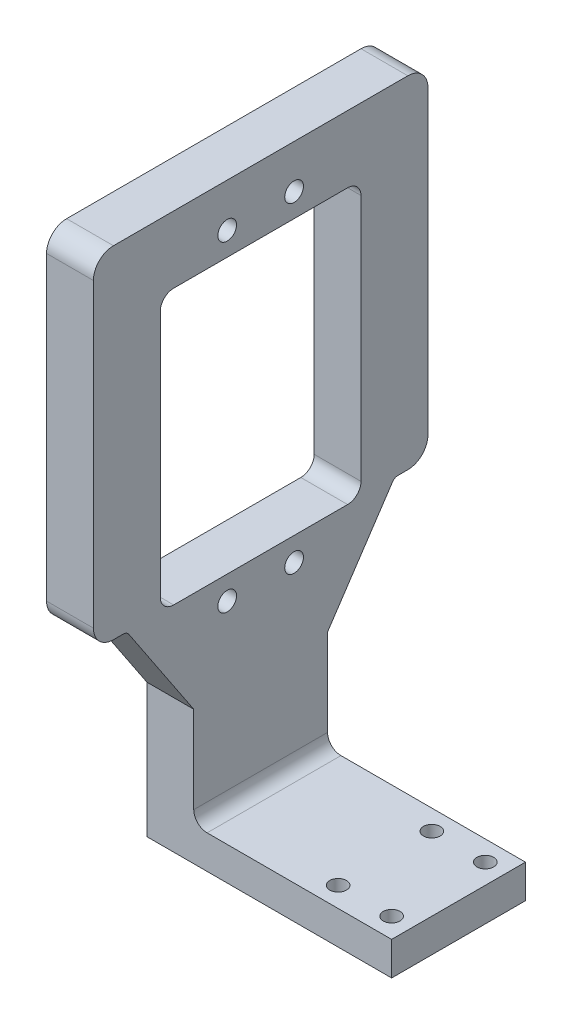
ISO-10303-21;
HEADER;
FILE_DESCRIPTION(('STEP AP214'),'2;1');
FILE_NAME('part.step','',(''),(''),'','','');
FILE_SCHEMA(('AUTOMOTIVE_DESIGN { 1 0 10303 214 1 1 1 1 }'));
ENDSEC;
DATA;
#1=APPLICATION_CONTEXT('core data for automotive mechanical design processes');
#2=APPLICATION_PROTOCOL_DEFINITION('international standard','automotive_design',2000,#1);
#3=PRODUCT_CONTEXT('',#1,'mechanical');
#4=PRODUCT('Part','Part','',(#3));
#5=PRODUCT_RELATED_PRODUCT_CATEGORY('part','',(#4));
#6=PRODUCT_DEFINITION_FORMATION('','',#4);
#7=PRODUCT_DEFINITION_CONTEXT('part definition',#1,'design');
#8=PRODUCT_DEFINITION('design','',#6,#7);
#9=PRODUCT_DEFINITION_SHAPE('','',#8);
#10=(LENGTH_UNIT() NAMED_UNIT(*) SI_UNIT(.MILLI.,.METRE.));
#11=(NAMED_UNIT(*) PLANE_ANGLE_UNIT() SI_UNIT($,.RADIAN.));
#12=(NAMED_UNIT(*) SI_UNIT($,.STERADIAN.) SOLID_ANGLE_UNIT());
#13=UNCERTAINTY_MEASURE_WITH_UNIT(LENGTH_MEASURE(1.E-05),#10,'distance_accuracy_value','');
#14=(GEOMETRIC_REPRESENTATION_CONTEXT(3) GLOBAL_UNCERTAINTY_ASSIGNED_CONTEXT((#13)) GLOBAL_UNIT_ASSIGNED_CONTEXT((#10,
#11,#12)) REPRESENTATION_CONTEXT('',''));
#15=CARTESIAN_POINT('',(0.,0.,0.));
#16=DIRECTION('',(0.,0.,1.));
#17=DIRECTION('',(1.,0.,0.));
#18=AXIS2_PLACEMENT_3D('',#15,#16,#17);
#19=CARTESIAN_POINT('',(0.,5.,0.));
#20=DIRECTION('',(0.,-1.,0.));
#21=DIRECTION('',(0.,0.,-1.));
#22=AXIS2_PLACEMENT_3D('',#19,#20,#21);
#23=PLANE('',#22);
#24=CARTESIAN_POINT('',(25.58,5.,-17.));
#25=DIRECTION('',(0.,1.,0.));
#26=DIRECTION('',(0.,0.,-1.));
#27=AXIS2_PLACEMENT_3D('',#24,#25,#26);
#28=CIRCLE('',#27,1.25);
#29=CARTESIAN_POINT('',(25.58,5.,-18.25));
#30=VERTEX_POINT('',#29);
#31=EDGE_CURVE('E299',#30,#30,#28,.T.);
#32=ORIENTED_EDGE('',*,*,#31,.F.);
#33=EDGE_LOOP('',(#32));
#34=FACE_BOUND('',#33,.T.);
#35=CARTESIAN_POINT('',(33.58,5.,-17.));
#36=DIRECTION('',(0.,1.,0.));
#37=DIRECTION('',(0.,0.,-1.));
#38=AXIS2_PLACEMENT_3D('',#35,#36,#37);
#39=CIRCLE('',#38,1.25);
#40=CARTESIAN_POINT('',(33.58,5.,-18.25));
#41=VERTEX_POINT('',#40);
#42=EDGE_CURVE('E305',#41,#41,#39,.T.);
#43=ORIENTED_EDGE('',*,*,#42,.F.);
#44=EDGE_LOOP('',(#43));
#45=FACE_BOUND('',#44,.T.);
#46=CARTESIAN_POINT('',(33.58,5.,-3.));
#47=DIRECTION('',(0.,1.,0.));
#48=DIRECTION('',(0.,0.,1.));
#49=AXIS2_PLACEMENT_3D('',#46,#47,#48);
#50=CIRCLE('',#49,1.25);
#51=CARTESIAN_POINT('',(33.58,5.,-1.75000000000001));
#52=VERTEX_POINT('',#51);
#53=EDGE_CURVE('E311',#52,#52,#50,.T.);
#54=ORIENTED_EDGE('',*,*,#53,.F.);
#55=EDGE_LOOP('',(#54));
#56=FACE_BOUND('',#55,.T.);
#57=CARTESIAN_POINT('',(25.58,5.,-3.));
#58=DIRECTION('',(0.,1.,0.));
#59=DIRECTION('',(0.,0.,1.));
#60=AXIS2_PLACEMENT_3D('',#57,#58,#59);
#61=CIRCLE('',#60,1.25);
#62=CARTESIAN_POINT('',(25.58,5.,-1.75));
#63=VERTEX_POINT('',#62);
#64=EDGE_CURVE('E317',#63,#63,#61,.T.);
#65=ORIENTED_EDGE('',*,*,#64,.F.);
#66=EDGE_LOOP('',(#65));
#67=FACE_BOUND('',#66,.T.);
#68=DIRECTION('',(-1.,0.,0.));
#69=VECTOR('',#68,1.);
#70=CARTESIAN_POINT('',(0.,5.,-20.));
#71=LINE('',#70,#69);
#72=CARTESIAN_POINT('',(36.58,5.,-20.));
#73=VERTEX_POINT('',#72);
#74=CARTESIAN_POINT('',(9.,5.,-20.));
#75=VERTEX_POINT('',#74);
#76=EDGE_CURVE('E328',#73,#75,#71,.T.);
#77=ORIENTED_EDGE('',*,*,#76,.T.);
#78=DIRECTION('',(0.,0.,-1.));
#79=VECTOR('',#78,1.);
#80=CARTESIAN_POINT('',(9.,5.,0.));
#81=LINE('',#80,#79);
#82=CARTESIAN_POINT('',(9.,5.,0.));
#83=VERTEX_POINT('',#82);
#84=EDGE_CURVE('E405',#75,#83,#81,.F.);
#85=ORIENTED_EDGE('',*,*,#84,.T.);
#86=DIRECTION('',(1.,0.,0.));
#87=VECTOR('',#86,1.);
#88=CARTESIAN_POINT('',(0.,5.,0.));
#89=LINE('',#88,#87);
#90=CARTESIAN_POINT('',(36.58,5.,0.));
#91=VERTEX_POINT('',#90);
#92=EDGE_CURVE('E323',#83,#91,#89,.T.);
#93=ORIENTED_EDGE('',*,*,#92,.T.);
#94=DIRECTION('',(0.,0.,-1.));
#95=VECTOR('',#94,1.);
#96=CARTESIAN_POINT('',(36.58,5.,0.));
#97=LINE('',#96,#95);
#98=EDGE_CURVE('E325',#91,#73,#97,.T.);
#99=ORIENTED_EDGE('',*,*,#98,.T.);
#100=EDGE_LOOP('',(#77,#85,#93,#99));
#101=FACE_BOUND('',#100,.T.);
#102=ADVANCED_FACE('F35',(#34,#45,#56,#67,#101),#23,.F.);
#103=CARTESIAN_POINT('',(0.,0.,0.));
#104=DIRECTION('',(0.,-1.,0.));
#105=DIRECTION('',(0.,0.,-1.));
#106=AXIS2_PLACEMENT_3D('',#103,#104,#105);
#107=PLANE('',#106);
#108=CARTESIAN_POINT('',(33.58,0.,-17.));
#109=DIRECTION('',(0.,1.,0.));
#110=DIRECTION('',(0.,0.,-1.));
#111=AXIS2_PLACEMENT_3D('',#108,#109,#110);
#112=CIRCLE('',#111,1.25);
#113=CARTESIAN_POINT('',(33.58,0.,-18.25));
#114=VERTEX_POINT('',#113);
#115=EDGE_CURVE('E302',#114,#114,#112,.T.);
#116=ORIENTED_EDGE('',*,*,#115,.T.);
#117=EDGE_LOOP('',(#116));
#118=FACE_BOUND('',#117,.T.);
#119=CARTESIAN_POINT('',(25.58,0.,-3.));
#120=DIRECTION('',(0.,1.,0.));
#121=DIRECTION('',(0.,0.,1.));
#122=AXIS2_PLACEMENT_3D('',#119,#120,#121);
#123=CIRCLE('',#122,1.25);
#124=CARTESIAN_POINT('',(25.58,0.,-1.75));
#125=VERTEX_POINT('',#124);
#126=EDGE_CURVE('E314',#125,#125,#123,.T.);
#127=ORIENTED_EDGE('',*,*,#126,.T.);
#128=EDGE_LOOP('',(#127));
#129=FACE_BOUND('',#128,.T.);
#130=DIRECTION('',(0.,0.,1.));
#131=VECTOR('',#130,1.);
#132=CARTESIAN_POINT('',(0.,0.,0.));
#133=LINE('',#132,#131);
#134=CARTESIAN_POINT('',(0.,0.,-20.));
#135=VERTEX_POINT('',#134);
#136=CARTESIAN_POINT('',(0.,0.,0.));
#137=VERTEX_POINT('',#136);
#138=EDGE_CURVE('E320',#135,#137,#133,.T.);
#139=ORIENTED_EDGE('',*,*,#138,.F.);
#140=DIRECTION('',(-1.,0.,0.));
#141=VECTOR('',#140,1.);
#142=CARTESIAN_POINT('',(0.,0.,-20.));
#143=LINE('',#142,#141);
#144=CARTESIAN_POINT('',(36.58,0.,-20.));
#145=VERTEX_POINT('',#144);
#146=EDGE_CURVE('E326',#145,#135,#143,.T.);
#147=ORIENTED_EDGE('',*,*,#146,.F.);
#148=DIRECTION('',(0.,0.,-1.));
#149=VECTOR('',#148,1.);
#150=CARTESIAN_POINT('',(36.58,0.,0.));
#151=LINE('',#150,#149);
#152=CARTESIAN_POINT('',(36.58,0.,0.));
#153=VERTEX_POINT('',#152);
#154=EDGE_CURVE('E335',#153,#145,#151,.T.);
#155=ORIENTED_EDGE('',*,*,#154,.F.);
#156=DIRECTION('',(1.,0.,0.));
#157=VECTOR('',#156,1.);
#158=CARTESIAN_POINT('',(0.,0.,0.));
#159=LINE('',#158,#157);
#160=EDGE_CURVE('E333',#137,#153,#159,.T.);
#161=ORIENTED_EDGE('',*,*,#160,.F.);
#162=EDGE_LOOP('',(#139,#147,#155,#161));
#163=FACE_BOUND('',#162,.T.);
#164=CARTESIAN_POINT('',(33.58,0.,-3.));
#165=DIRECTION('',(0.,1.,0.));
#166=DIRECTION('',(0.,0.,1.));
#167=AXIS2_PLACEMENT_3D('',#164,#165,#166);
#168=CIRCLE('',#167,1.25);
#169=CARTESIAN_POINT('',(33.58,0.,-1.75000000000001));
#170=VERTEX_POINT('',#169);
#171=EDGE_CURVE('E308',#170,#170,#168,.T.);
#172=ORIENTED_EDGE('',*,*,#171,.T.);
#173=EDGE_LOOP('',(#172));
#174=FACE_BOUND('',#173,.T.);
#175=CARTESIAN_POINT('',(25.58,0.,-17.));
#176=DIRECTION('',(0.,1.,0.));
#177=DIRECTION('',(0.,0.,-1.));
#178=AXIS2_PLACEMENT_3D('',#175,#176,#177);
#179=CIRCLE('',#178,1.25);
#180=CARTESIAN_POINT('',(25.58,0.,-18.25));
#181=VERTEX_POINT('',#180);
#182=EDGE_CURVE('E297',#181,#181,#179,.T.);
#183=ORIENTED_EDGE('',*,*,#182,.T.);
#184=EDGE_LOOP('',(#183));
#185=FACE_BOUND('',#184,.T.);
#186=ADVANCED_FACE('F483',(#118,#129,#163,#174,#185),#107,.T.);
#187=CARTESIAN_POINT('',(0.,5.,0.));
#188=DIRECTION('',(1.,0.,0.));
#189=DIRECTION('',(0.,0.,-1.));
#190=AXIS2_PLACEMENT_3D('',#187,#188,#189);
#191=PLANE('',#190);
#192=CARTESIAN_POINT('',(0.,31.5,-5.));
#193=DIRECTION('',(-1.,0.,0.));
#194=DIRECTION('',(0.,0.,-1.));
#195=AXIS2_PLACEMENT_3D('',#192,#193,#194);
#196=CIRCLE('',#195,1.4);
#197=CARTESIAN_POINT('',(0.,31.5,-6.4));
#198=VERTEX_POINT('',#197);
#199=EDGE_CURVE('E570',#198,#198,#196,.T.);
#200=ORIENTED_EDGE('',*,*,#199,.F.);
#201=EDGE_LOOP('',(#200));
#202=FACE_BOUND('',#201,.T.);
#203=CARTESIAN_POINT('',(0.,79.5,-15.));
#204=DIRECTION('',(-1.,0.,0.));
#205=DIRECTION('',(0.,0.,-1.));
#206=AXIS2_PLACEMENT_3D('',#203,#204,#205);
#207=CIRCLE('',#206,1.4);
#208=CARTESIAN_POINT('',(0.,79.5,-16.4));
#209=VERTEX_POINT('',#208);
#210=EDGE_CURVE('E571',#209,#209,#207,.T.);
#211=ORIENTED_EDGE('',*,*,#210,.F.);
#212=EDGE_LOOP('',(#211));
#213=FACE_BOUND('',#212,.T.);
#214=CARTESIAN_POINT('',(0.,79.5,-5.));
#215=DIRECTION('',(-1.,0.,0.));
#216=DIRECTION('',(0.,0.,1.));
#217=AXIS2_PLACEMENT_3D('',#214,#215,#216);
#218=CIRCLE('',#217,1.4);
#219=CARTESIAN_POINT('',(0.,79.5,-3.6));
#220=VERTEX_POINT('',#219);
#221=EDGE_CURVE('E581',#220,#220,#218,.T.);
#222=ORIENTED_EDGE('',*,*,#221,.F.);
#223=EDGE_LOOP('',(#222));
#224=FACE_BOUND('',#223,.T.);
#225=CARTESIAN_POINT('',(0.,31.5,-15.));
#226=DIRECTION('',(-1.,0.,0.));
#227=DIRECTION('',(0.,0.,1.));
#228=AXIS2_PLACEMENT_3D('',#225,#226,#227);
#229=CIRCLE('',#228,1.4);
#230=CARTESIAN_POINT('',(0.,31.5,-13.6));
#231=VERTEX_POINT('',#230);
#232=EDGE_CURVE('E563',#231,#231,#229,.T.);
#233=ORIENTED_EDGE('',*,*,#232,.F.);
#234=EDGE_LOOP('',(#233));
#235=FACE_BOUND('',#234,.T.);
#236=DIRECTION('',(0.,0.,1.));
#237=VECTOR('',#236,1.);
#238=CARTESIAN_POINT('',(0.,86.,0.));
#239=LINE('',#238,#237);
#240=CARTESIAN_POINT('',(0.,86.,-32.));
#241=VERTEX_POINT('',#240);
#242=CARTESIAN_POINT('',(0.,86.,12.));
#243=VERTEX_POINT('',#242);
#244=EDGE_CURVE('E268',#241,#243,#239,.T.);
#245=ORIENTED_EDGE('',*,*,#244,.F.);
#246=CARTESIAN_POINT('',(0.,83.,-32.));
#247=DIRECTION('',(1.,0.,0.));
#248=DIRECTION('',(0.,0.,-1.));
#249=AXIS2_PLACEMENT_3D('',#246,#247,#248);
#250=CIRCLE('',#249,3.);
#251=CARTESIAN_POINT('',(0.,83.,-35.));
#252=VERTEX_POINT('',#251);
#253=EDGE_CURVE('E360',#241,#252,#250,.F.);
#254=ORIENTED_EDGE('',*,*,#253,.T.);
#255=DIRECTION('',(0.,1.,0.));
#256=VECTOR('',#255,1.);
#257=CARTESIAN_POINT('',(0.,0.,-35.));
#258=LINE('',#257,#256);
#259=CARTESIAN_POINT('',(0.,38.,-35.));
#260=VERTEX_POINT('',#259);
#261=EDGE_CURVE('E272',#260,#252,#258,.T.);
#262=ORIENTED_EDGE('',*,*,#261,.F.);
#263=CARTESIAN_POINT('',(0.,38.,-32.));
#264=DIRECTION('',(1.,0.,0.));
#265=DIRECTION('',(0.,0.,-1.));
#266=AXIS2_PLACEMENT_3D('',#263,#264,#265);
#267=CIRCLE('',#266,3.);
#268=CARTESIAN_POINT('',(0.,35.,-32.));
#269=VERTEX_POINT('',#268);
#270=EDGE_CURVE('E353',#260,#269,#267,.F.);
#271=ORIENTED_EDGE('',*,*,#270,.T.);
#272=DIRECTION('',(0.,0.,-1.));
#273=VECTOR('',#272,1.);
#274=CARTESIAN_POINT('',(0.,35.,0.));
#275=LINE('',#274,#273);
#276=CARTESIAN_POINT('',(0.,35.,-30.535183758488));
#277=VERTEX_POINT('',#276);
#278=EDGE_CURVE('E275',#277,#269,#275,.T.);
#279=ORIENTED_EDGE('',*,*,#278,.F.);
#280=CARTESIAN_POINT('',(0.,34.,-30.535183758488));
#281=DIRECTION('',(1.,0.,0.));
#282=DIRECTION('',(0.,0.,-1.));
#283=AXIS2_PLACEMENT_3D('',#280,#281,#282);
#284=CIRCLE('',#283,1.);
#285=CARTESIAN_POINT('',(0.,34.5547001962252,-29.7031334641502));
#286=VERTEX_POINT('',#285);
#287=EDGE_CURVE('E400',#277,#286,#284,.T.);
#288=ORIENTED_EDGE('',*,*,#287,.T.);
#289=DIRECTION('',(0.,0.832050294337844,-0.554700196225229));
#290=VECTOR('',#289,1.);
#291=CARTESIAN_POINT('',(0.,-3.07692307692308,-4.61538461538461));
#292=LINE('',#291,#290);
#293=CARTESIAN_POINT('',(0.,20.,-20.));
#294=VERTEX_POINT('',#293);
#295=EDGE_CURVE('E277',#294,#286,#292,.T.);
#296=ORIENTED_EDGE('',*,*,#295,.F.);
#297=DIRECTION('',(0.,-1.,0.));
#298=VECTOR('',#297,1.);
#299=CARTESIAN_POINT('',(0.,5.,-20.));
#300=LINE('',#299,#298);
#301=EDGE_CURVE('E232',#294,#135,#300,.T.);
#302=ORIENTED_EDGE('',*,*,#301,.T.);
#303=ORIENTED_EDGE('',*,*,#138,.T.);
#304=DIRECTION('',(0.,-1.,0.));
#305=VECTOR('',#304,1.);
#306=CARTESIAN_POINT('',(0.,5.,0.));
#307=LINE('',#306,#305);
#308=CARTESIAN_POINT('',(0.,20.,0.));
#309=VERTEX_POINT('',#308);
#310=EDGE_CURVE('E345',#309,#137,#307,.T.);
#311=ORIENTED_EDGE('',*,*,#310,.F.);
#312=DIRECTION('',(0.,0.832050294337844,0.554700196225229));
#313=VECTOR('',#312,1.);
#314=CARTESIAN_POINT('',(0.,6.15384615384615,-9.23076923076923));
#315=LINE('',#314,#313);
#316=CARTESIAN_POINT('',(0.,34.5547001962252,9.70313346415015));
#317=VERTEX_POINT('',#316);
#318=EDGE_CURVE('E279',#309,#317,#315,.T.);
#319=ORIENTED_EDGE('',*,*,#318,.T.);
#320=CARTESIAN_POINT('',(0.,34.,10.535183758488));
#321=DIRECTION('',(1.,0.,0.));
#322=DIRECTION('',(0.,0.,-1.));
#323=AXIS2_PLACEMENT_3D('',#320,#321,#322);
#324=CIRCLE('',#323,1.);
#325=CARTESIAN_POINT('',(0.,35.,10.535183758488));
#326=VERTEX_POINT('',#325);
#327=EDGE_CURVE('E396',#317,#326,#324,.T.);
#328=ORIENTED_EDGE('',*,*,#327,.T.);
#329=DIRECTION('',(0.,0.,1.));
#330=VECTOR('',#329,1.);
#331=CARTESIAN_POINT('',(0.,35.,0.));
#332=LINE('',#331,#330);
#333=CARTESIAN_POINT('',(0.,35.,12.));
#334=VERTEX_POINT('',#333);
#335=EDGE_CURVE('E282',#326,#334,#332,.T.);
#336=ORIENTED_EDGE('',*,*,#335,.T.);
#337=CARTESIAN_POINT('',(0.,38.,12.));
#338=DIRECTION('',(1.,0.,0.));
#339=DIRECTION('',(0.,0.,-1.));
#340=AXIS2_PLACEMENT_3D('',#337,#338,#339);
#341=CIRCLE('',#340,3.);
#342=CARTESIAN_POINT('',(0.,38.,15.));
#343=VERTEX_POINT('',#342);
#344=EDGE_CURVE('E356',#334,#343,#341,.F.);
#345=ORIENTED_EDGE('',*,*,#344,.T.);
#346=DIRECTION('',(0.,1.,0.));
#347=VECTOR('',#346,1.);
#348=CARTESIAN_POINT('',(0.,0.,15.));
#349=LINE('',#348,#347);
#350=CARTESIAN_POINT('',(0.,83.,15.));
#351=VERTEX_POINT('',#350);
#352=EDGE_CURVE('E265',#343,#351,#349,.T.);
#353=ORIENTED_EDGE('',*,*,#352,.T.);
#354=CARTESIAN_POINT('',(0.,83.,12.));
#355=DIRECTION('',(1.,0.,0.));
#356=DIRECTION('',(0.,0.,-1.));
#357=AXIS2_PLACEMENT_3D('',#354,#355,#356);
#358=CIRCLE('',#357,3.);
#359=EDGE_CURVE('E358',#351,#243,#358,.F.);
#360=ORIENTED_EDGE('',*,*,#359,.T.);
#361=EDGE_LOOP('',(#245,#254,#262,#271,#279,#288,#296,#302,#303,#311,#319,#328,#336,#345,#353,#360));
#362=FACE_BOUND('',#361,.T.);
#363=DIRECTION('',(0.,0.,-1.));
#364=VECTOR('',#363,1.);
#365=CARTESIAN_POINT('',(0.,76.,0.));
#366=LINE('',#365,#364);
#367=CARTESIAN_POINT('',(0.,76.,3.));
#368=VERTEX_POINT('',#367);
#369=CARTESIAN_POINT('',(0.,76.,-23.));
#370=VERTEX_POINT('',#369);
#371=EDGE_CURVE('E284',#368,#370,#366,.T.);
#372=ORIENTED_EDGE('',*,*,#371,.F.);
#373=CARTESIAN_POINT('',(0.,74.,3.));
#374=DIRECTION('',(1.,0.,0.));
#375=DIRECTION('',(0.,0.,-1.));
#376=AXIS2_PLACEMENT_3D('',#373,#374,#375);
#377=CIRCLE('',#376,2.);
#378=CARTESIAN_POINT('',(0.,74.,5.));
#379=VERTEX_POINT('',#378);
#380=EDGE_CURVE('E50',#368,#379,#377,.T.);
#381=ORIENTED_EDGE('',*,*,#380,.T.);
#382=DIRECTION('',(0.,1.,0.));
#383=VECTOR('',#382,1.);
#384=CARTESIAN_POINT('',(0.,0.,5.));
#385=LINE('',#384,#383);
#386=CARTESIAN_POINT('',(0.,37.,5.));
#387=VERTEX_POINT('',#386);
#388=EDGE_CURVE('E287',#387,#379,#385,.T.);
#389=ORIENTED_EDGE('',*,*,#388,.F.);
#390=CARTESIAN_POINT('',(0.,37.,3.));
#391=DIRECTION('',(1.,0.,0.));
#392=DIRECTION('',(0.,0.,-1.));
#393=AXIS2_PLACEMENT_3D('',#390,#391,#392);
#394=CIRCLE('',#393,2.);
#395=CARTESIAN_POINT('',(0.,35.,3.));
#396=VERTEX_POINT('',#395);
#397=EDGE_CURVE('E43',#387,#396,#394,.T.);
#398=ORIENTED_EDGE('',*,*,#397,.T.);
#399=DIRECTION('',(0.,0.,1.));
#400=VECTOR('',#399,1.);
#401=CARTESIAN_POINT('',(0.,35.,0.));
#402=LINE('',#401,#400);
#403=CARTESIAN_POINT('',(0.,35.,-23.));
#404=VERTEX_POINT('',#403);
#405=EDGE_CURVE('E289',#404,#396,#402,.T.);
#406=ORIENTED_EDGE('',*,*,#405,.F.);
#407=CARTESIAN_POINT('',(0.,37.,-23.));
#408=DIRECTION('',(1.,0.,0.));
#409=DIRECTION('',(0.,0.,-1.));
#410=AXIS2_PLACEMENT_3D('',#407,#408,#409);
#411=CIRCLE('',#410,2.);
#412=CARTESIAN_POINT('',(0.,37.,-25.));
#413=VERTEX_POINT('',#412);
#414=EDGE_CURVE('E430',#404,#413,#411,.T.);
#415=ORIENTED_EDGE('',*,*,#414,.T.);
#416=DIRECTION('',(0.,1.,0.));
#417=VECTOR('',#416,1.);
#418=CARTESIAN_POINT('',(0.,0.,-25.));
#419=LINE('',#418,#417);
#420=CARTESIAN_POINT('',(0.,74.,-25.));
#421=VERTEX_POINT('',#420);
#422=EDGE_CURVE('E292',#413,#421,#419,.T.);
#423=ORIENTED_EDGE('',*,*,#422,.T.);
#424=CARTESIAN_POINT('',(0.,74.,-23.));
#425=DIRECTION('',(1.,0.,0.));
#426=DIRECTION('',(0.,0.,-1.));
#427=AXIS2_PLACEMENT_3D('',#424,#425,#426);
#428=CIRCLE('',#427,2.);
#429=EDGE_CURVE('E434',#421,#370,#428,.T.);
#430=ORIENTED_EDGE('',*,*,#429,.T.);
#431=EDGE_LOOP('',(#372,#381,#389,#398,#406,#415,#423,#430));
#432=FACE_BOUND('',#431,.T.);
#433=ADVANCED_FACE('F441',(#202,#213,#224,#235,#362,#432),#191,.F.);
#434=CARTESIAN_POINT('',(0.,5.,0.));
#435=DIRECTION('',(0.,0.,-1.));
#436=DIRECTION('',(-1.,0.,0.));
#437=AXIS2_PLACEMENT_3D('',#434,#435,#436);
#438=PLANE('',#437);
#439=ORIENTED_EDGE('',*,*,#160,.T.);
#440=DIRECTION('',(0.,-1.,0.));
#441=VECTOR('',#440,1.);
#442=CARTESIAN_POINT('',(36.58,5.,0.));
#443=LINE('',#442,#441);
#444=EDGE_CURVE('E342',#91,#153,#443,.T.);
#445=ORIENTED_EDGE('',*,*,#444,.F.);
#446=ORIENTED_EDGE('',*,*,#92,.F.);
#447=CARTESIAN_POINT('',(9.,7.,0.));
#448=DIRECTION('',(0.,0.,-1.));
#449=DIRECTION('',(-1.,0.,0.));
#450=AXIS2_PLACEMENT_3D('',#447,#448,#449);
#451=CIRCLE('',#450,2.);
#452=CARTESIAN_POINT('',(7.,7.,0.));
#453=VERTEX_POINT('',#452);
#454=EDGE_CURVE('E428',#83,#453,#451,.T.);
#455=ORIENTED_EDGE('',*,*,#454,.T.);
#456=DIRECTION('',(0.,1.,0.));
#457=VECTOR('',#456,1.);
#458=CARTESIAN_POINT('',(7.,0.,0.));
#459=LINE('',#458,#457);
#460=CARTESIAN_POINT('',(7.,20.,0.));
#461=VERTEX_POINT('',#460);
#462=EDGE_CURVE('E226',#453,#461,#459,.T.);
#463=ORIENTED_EDGE('',*,*,#462,.T.);
#464=DIRECTION('',(-1.,0.,0.));
#465=VECTOR('',#464,1.);
#466=CARTESIAN_POINT('',(7.,20.,0.));
#467=LINE('',#466,#465);
#468=EDGE_CURVE('E236',#461,#309,#467,.T.);
#469=ORIENTED_EDGE('',*,*,#468,.T.);
#470=ORIENTED_EDGE('',*,*,#310,.T.);
#471=EDGE_LOOP('',(#439,#445,#446,#455,#463,#469,#470));
#472=FACE_BOUND('',#471,.T.);
#473=ADVANCED_FACE('F502',(#472),#438,.F.);
#474=CARTESIAN_POINT('',(36.58,5.,0.));
#475=DIRECTION('',(-1.,0.,0.));
#476=DIRECTION('',(0.,0.,1.));
#477=AXIS2_PLACEMENT_3D('',#474,#475,#476);
#478=PLANE('',#477);
#479=ORIENTED_EDGE('',*,*,#154,.T.);
#480=DIRECTION('',(0.,-1.,0.));
#481=VECTOR('',#480,1.);
#482=CARTESIAN_POINT('',(36.58,5.,-20.));
#483=LINE('',#482,#481);
#484=EDGE_CURVE('E339',#73,#145,#483,.T.);
#485=ORIENTED_EDGE('',*,*,#484,.F.);
#486=ORIENTED_EDGE('',*,*,#98,.F.);
#487=ORIENTED_EDGE('',*,*,#444,.T.);
#488=EDGE_LOOP('',(#479,#485,#486,#487));
#489=FACE_BOUND('',#488,.T.);
#490=ADVANCED_FACE('F499',(#489),#478,.F.);
#491=CARTESIAN_POINT('',(0.,5.,-20.));
#492=DIRECTION('',(0.,0.,1.));
#493=DIRECTION('',(1.,0.,0.));
#494=AXIS2_PLACEMENT_3D('',#491,#492,#493);
#495=PLANE('',#494);
#496=ORIENTED_EDGE('',*,*,#146,.T.);
#497=ORIENTED_EDGE('',*,*,#301,.F.);
#498=DIRECTION('',(-1.,0.,0.));
#499=VECTOR('',#498,1.);
#500=CARTESIAN_POINT('',(7.,20.,-20.));
#501=LINE('',#500,#499);
#502=CARTESIAN_POINT('',(7.,20.,-20.));
#503=VERTEX_POINT('',#502);
#504=EDGE_CURVE('E229',#503,#294,#501,.T.);
#505=ORIENTED_EDGE('',*,*,#504,.F.);
#506=DIRECTION('',(0.,1.,0.));
#507=VECTOR('',#506,1.);
#508=CARTESIAN_POINT('',(7.,0.,-20.));
#509=LINE('',#508,#507);
#510=CARTESIAN_POINT('',(7.,7.,-20.));
#511=VERTEX_POINT('',#510);
#512=EDGE_CURVE('E215',#511,#503,#509,.T.);
#513=ORIENTED_EDGE('',*,*,#512,.F.);
#514=CARTESIAN_POINT('',(9.,7.,-20.));
#515=DIRECTION('',(0.,0.,1.));
#516=DIRECTION('',(1.,0.,0.));
#517=AXIS2_PLACEMENT_3D('',#514,#515,#516);
#518=CIRCLE('',#517,2.);
#519=EDGE_CURVE('E426',#511,#75,#518,.T.);
#520=ORIENTED_EDGE('',*,*,#519,.T.);
#521=ORIENTED_EDGE('',*,*,#76,.F.);
#522=ORIENTED_EDGE('',*,*,#484,.T.);
#523=EDGE_LOOP('',(#496,#497,#505,#513,#520,#521,#522));
#524=FACE_BOUND('',#523,.T.);
#525=ADVANCED_FACE('F230',(#524),#495,.F.);
#526=CARTESIAN_POINT('',(25.58,5.,-3.));
#527=DIRECTION('',(0.,-1.,0.));
#528=DIRECTION('',(0.,0.,-1.));
#529=AXIS2_PLACEMENT_3D('',#526,#527,#528);
#530=CYLINDRICAL_SURFACE('',#529,1.25);
#531=ORIENTED_EDGE('',*,*,#64,.T.);
#532=EDGE_LOOP('',(#531));
#533=FACE_BOUND('',#532,.T.);
#534=ORIENTED_EDGE('',*,*,#126,.F.);
#535=EDGE_LOOP('',(#534));
#536=FACE_BOUND('',#535,.T.);
#537=ADVANCED_FACE('F494',(#533,#536),#530,.F.);
#538=CARTESIAN_POINT('',(33.58,5.,-3.));
#539=DIRECTION('',(0.,-1.,0.));
#540=DIRECTION('',(0.,0.,-1.));
#541=AXIS2_PLACEMENT_3D('',#538,#539,#540);
#542=CYLINDRICAL_SURFACE('',#541,1.25);
#543=ORIENTED_EDGE('',*,*,#53,.T.);
#544=EDGE_LOOP('',(#543));
#545=FACE_BOUND('',#544,.T.);
#546=ORIENTED_EDGE('',*,*,#171,.F.);
#547=EDGE_LOOP('',(#546));
#548=FACE_BOUND('',#547,.T.);
#549=ADVANCED_FACE('F644',(#545,#548),#542,.F.);
#550=CARTESIAN_POINT('',(33.58,5.,-17.));
#551=DIRECTION('',(0.,-1.,0.));
#552=DIRECTION('',(0.,0.,-1.));
#553=AXIS2_PLACEMENT_3D('',#550,#551,#552);
#554=CYLINDRICAL_SURFACE('',#553,1.25);
#555=ORIENTED_EDGE('',*,*,#42,.T.);
#556=EDGE_LOOP('',(#555));
#557=FACE_BOUND('',#556,.T.);
#558=ORIENTED_EDGE('',*,*,#115,.F.);
#559=EDGE_LOOP('',(#558));
#560=FACE_BOUND('',#559,.T.);
#561=ADVANCED_FACE('F636',(#557,#560),#554,.F.);
#562=CARTESIAN_POINT('',(25.58,5.,-17.));
#563=DIRECTION('',(0.,-1.,0.));
#564=DIRECTION('',(0.,0.,-1.));
#565=AXIS2_PLACEMENT_3D('',#562,#563,#564);
#566=CYLINDRICAL_SURFACE('',#565,1.25);
#567=ORIENTED_EDGE('',*,*,#31,.T.);
#568=EDGE_LOOP('',(#567));
#569=FACE_BOUND('',#568,.T.);
#570=ORIENTED_EDGE('',*,*,#182,.F.);
#571=EDGE_LOOP('',(#570));
#572=FACE_BOUND('',#571,.T.);
#573=ADVANCED_FACE('F634',(#569,#572),#566,.F.);
#574=CARTESIAN_POINT('',(7.,76.,0.));
#575=DIRECTION('',(0.,1.,0.));
#576=DIRECTION('',(0.,0.,1.));
#577=AXIS2_PLACEMENT_3D('',#574,#575,#576);
#578=PLANE('',#577);
#579=ORIENTED_EDGE('',*,*,#371,.T.);
#580=DIRECTION('',(-1.,0.,0.));
#581=VECTOR('',#580,1.);
#582=CARTESIAN_POINT('',(7.,76.,-23.));
#583=LINE('',#582,#581);
#584=CARTESIAN_POINT('',(7.,76.,-23.));
#585=VERTEX_POINT('',#584);
#586=EDGE_CURVE('E420',#370,#585,#583,.F.);
#587=ORIENTED_EDGE('',*,*,#586,.T.);
#588=DIRECTION('',(0.,0.,-1.));
#589=VECTOR('',#588,1.);
#590=CARTESIAN_POINT('',(7.,76.,0.));
#591=LINE('',#590,#589);
#592=CARTESIAN_POINT('',(7.,76.,3.));
#593=VERTEX_POINT('',#592);
#594=EDGE_CURVE('E254',#593,#585,#591,.T.);
#595=ORIENTED_EDGE('',*,*,#594,.F.);
#596=DIRECTION('',(-1.,0.,0.));
#597=VECTOR('',#596,1.);
#598=CARTESIAN_POINT('',(0.,76.,3.));
#599=LINE('',#598,#597);
#600=EDGE_CURVE('E417',#593,#368,#599,.T.);
#601=ORIENTED_EDGE('',*,*,#600,.T.);
#602=EDGE_LOOP('',(#579,#587,#595,#601));
#603=FACE_BOUND('',#602,.T.);
#604=ADVANCED_FACE('F458',(#603),#578,.F.);
#605=CARTESIAN_POINT('',(7.,0.,-25.));
#606=DIRECTION('',(0.,0.,1.));
#607=DIRECTION('',(1.,0.,0.));
#608=AXIS2_PLACEMENT_3D('',#605,#606,#607);
#609=PLANE('',#608);
#610=ORIENTED_EDGE('',*,*,#422,.F.);
#611=DIRECTION('',(-1.,0.,0.));
#612=VECTOR('',#611,1.);
#613=CARTESIAN_POINT('',(7.,37.,-25.));
#614=LINE('',#613,#612);
#615=CARTESIAN_POINT('',(7.,37.,-25.));
#616=VERTEX_POINT('',#615);
#617=EDGE_CURVE('E415',#413,#616,#614,.F.);
#618=ORIENTED_EDGE('',*,*,#617,.T.);
#619=DIRECTION('',(0.,1.,0.));
#620=VECTOR('',#619,1.);
#621=CARTESIAN_POINT('',(7.,0.,-25.));
#622=LINE('',#621,#620);
#623=CARTESIAN_POINT('',(7.,74.,-25.));
#624=VERTEX_POINT('',#623);
#625=EDGE_CURVE('E237',#616,#624,#622,.T.);
#626=ORIENTED_EDGE('',*,*,#625,.T.);
#627=DIRECTION('',(-1.,0.,0.));
#628=VECTOR('',#627,1.);
#629=CARTESIAN_POINT('',(7.,74.,-25.));
#630=LINE('',#629,#628);
#631=EDGE_CURVE('E412',#624,#421,#630,.T.);
#632=ORIENTED_EDGE('',*,*,#631,.T.);
#633=EDGE_LOOP('',(#610,#618,#626,#632));
#634=FACE_BOUND('',#633,.T.);
#635=ADVANCED_FACE('F467',(#634),#609,.T.);
#636=CARTESIAN_POINT('',(7.,35.,0.));
#637=DIRECTION('',(0.,-1.,0.));
#638=DIRECTION('',(0.,0.,-1.));
#639=AXIS2_PLACEMENT_3D('',#636,#637,#638);
#640=PLANE('',#639);
#641=DIRECTION('',(0.,0.,1.));
#642=VECTOR('',#641,1.);
#643=CARTESIAN_POINT('',(7.,35.,0.));
#644=LINE('',#643,#642);
#645=CARTESIAN_POINT('',(7.,35.,-23.));
#646=VERTEX_POINT('',#645);
#647=CARTESIAN_POINT('',(7.,35.,3.));
#648=VERTEX_POINT('',#647);
#649=EDGE_CURVE('E260',#646,#648,#644,.T.);
#650=ORIENTED_EDGE('',*,*,#649,.F.);
#651=DIRECTION('',(-1.,0.,0.));
#652=VECTOR('',#651,1.);
#653=CARTESIAN_POINT('',(7.,35.,-23.));
#654=LINE('',#653,#652);
#655=EDGE_CURVE('E409',#646,#404,#654,.T.);
#656=ORIENTED_EDGE('',*,*,#655,.T.);
#657=ORIENTED_EDGE('',*,*,#405,.T.);
#658=DIRECTION('',(-1.,0.,0.));
#659=VECTOR('',#658,1.);
#660=CARTESIAN_POINT('',(7.,35.,3.));
#661=LINE('',#660,#659);
#662=EDGE_CURVE('E407',#396,#648,#661,.F.);
#663=ORIENTED_EDGE('',*,*,#662,.T.);
#664=EDGE_LOOP('',(#650,#656,#657,#663));
#665=FACE_BOUND('',#664,.T.);
#666=ADVANCED_FACE('F444',(#665),#640,.F.);
#667=CARTESIAN_POINT('',(7.,0.,15.));
#668=DIRECTION('',(0.,0.,1.));
#669=DIRECTION('',(1.,0.,0.));
#670=AXIS2_PLACEMENT_3D('',#667,#668,#669);
#671=PLANE('',#670);
#672=DIRECTION('',(0.,1.,0.));
#673=VECTOR('',#672,1.);
#674=CARTESIAN_POINT('',(7.,0.,15.));
#675=LINE('',#674,#673);
#676=CARTESIAN_POINT('',(7.,38.,15.));
#677=VERTEX_POINT('',#676);
#678=CARTESIAN_POINT('',(7.,83.,15.));
#679=VERTEX_POINT('',#678);
#680=EDGE_CURVE('E295',#677,#679,#675,.T.);
#681=ORIENTED_EDGE('',*,*,#680,.T.);
#682=DIRECTION('',(-1.,0.,0.));
#683=VECTOR('',#682,1.);
#684=CARTESIAN_POINT('',(0.,83.,15.));
#685=LINE('',#684,#683);
#686=EDGE_CURVE('E378',#679,#351,#685,.T.);
#687=ORIENTED_EDGE('',*,*,#686,.T.);
#688=ORIENTED_EDGE('',*,*,#352,.F.);
#689=DIRECTION('',(-1.,0.,0.));
#690=VECTOR('',#689,1.);
#691=CARTESIAN_POINT('',(7.,38.,15.));
#692=LINE('',#691,#690);
#693=EDGE_CURVE('E376',#343,#677,#692,.F.);
#694=ORIENTED_EDGE('',*,*,#693,.T.);
#695=EDGE_LOOP('',(#681,#687,#688,#694));
#696=FACE_BOUND('',#695,.T.);
#697=ADVANCED_FACE('F601',(#696),#671,.T.);
#698=CARTESIAN_POINT('',(7.,35.,0.));
#699=DIRECTION('',(0.,-1.,0.));
#700=DIRECTION('',(0.,0.,-1.));
#701=AXIS2_PLACEMENT_3D('',#698,#699,#700);
#702=PLANE('',#701);
#703=ORIENTED_EDGE('',*,*,#335,.F.);
#704=DIRECTION('',(-1.,0.,0.));
#705=VECTOR('',#704,1.);
#706=CARTESIAN_POINT('',(7.,35.,10.535183758488));
#707=LINE('',#706,#705);
#708=CARTESIAN_POINT('',(7.,35.,10.535183758488));
#709=VERTEX_POINT('',#708);
#710=EDGE_CURVE('E390',#326,#709,#707,.F.);
#711=ORIENTED_EDGE('',*,*,#710,.T.);
#712=DIRECTION('',(0.,0.,1.));
#713=VECTOR('',#712,1.);
#714=CARTESIAN_POINT('',(7.,35.,0.));
#715=LINE('',#714,#713);
#716=CARTESIAN_POINT('',(7.,35.,12.));
#717=VERTEX_POINT('',#716);
#718=EDGE_CURVE('E252',#709,#717,#715,.T.);
#719=ORIENTED_EDGE('',*,*,#718,.T.);
#720=DIRECTION('',(-1.,0.,0.));
#721=VECTOR('',#720,1.);
#722=CARTESIAN_POINT('',(7.,35.,12.));
#723=LINE('',#722,#721);
#724=EDGE_CURVE('E381',#717,#334,#723,.T.);
#725=ORIENTED_EDGE('',*,*,#724,.T.);
#726=EDGE_LOOP('',(#703,#711,#719,#725));
#727=FACE_BOUND('',#726,.T.);
#728=ADVANCED_FACE('F798',(#727),#702,.T.);
#729=CARTESIAN_POINT('',(7.,6.15384615384615,-9.23076923076923));
#730=DIRECTION('',(0.,-0.554700196225229,0.832050294337844));
#731=DIRECTION('',(0.,-0.832050294337844,-0.554700196225229));
#732=AXIS2_PLACEMENT_3D('',#729,#730,#731);
#733=PLANE('',#732);
#734=DIRECTION('',(0.,0.832050294337844,0.554700196225229));
#735=VECTOR('',#734,1.);
#736=CARTESIAN_POINT('',(7.,6.15384615384615,-9.23076923076923));
#737=LINE('',#736,#735);
#738=CARTESIAN_POINT('',(7.,34.5547001962252,9.70313346415015));
#739=VERTEX_POINT('',#738);
#740=EDGE_CURVE('E249',#461,#739,#737,.T.);
#741=ORIENTED_EDGE('',*,*,#740,.T.);
#742=DIRECTION('',(-1.,0.,0.));
#743=VECTOR('',#742,1.);
#744=CARTESIAN_POINT('',(0.,34.5547001962252,9.70313346415015));
#745=LINE('',#744,#743);
#746=EDGE_CURVE('E387',#739,#317,#745,.T.);
#747=ORIENTED_EDGE('',*,*,#746,.T.);
#748=ORIENTED_EDGE('',*,*,#318,.F.);
#749=ORIENTED_EDGE('',*,*,#468,.F.);
#750=EDGE_LOOP('',(#741,#747,#748,#749));
#751=FACE_BOUND('',#750,.T.);
#752=ADVANCED_FACE('F614',(#751),#733,.T.);
#753=CARTESIAN_POINT('',(7.,-3.07692307692308,-4.61538461538461));
#754=DIRECTION('',(0.,0.554700196225229,0.832050294337844));
#755=DIRECTION('',(0.,-0.832050294337844,0.554700196225229));
#756=AXIS2_PLACEMENT_3D('',#753,#754,#755);
#757=PLANE('',#756);
#758=ORIENTED_EDGE('',*,*,#295,.T.);
#759=DIRECTION('',(-1.,0.,0.));
#760=VECTOR('',#759,1.);
#761=CARTESIAN_POINT('',(7.,34.5547001962252,-29.7031334641502));
#762=LINE('',#761,#760);
#763=CARTESIAN_POINT('',(7.,34.5547001962252,-29.7031334641502));
#764=VERTEX_POINT('',#763);
#765=EDGE_CURVE('E241',#286,#764,#762,.F.);
#766=ORIENTED_EDGE('',*,*,#765,.T.);
#767=DIRECTION('',(0.,0.832050294337844,-0.554700196225229));
#768=VECTOR('',#767,1.);
#769=CARTESIAN_POINT('',(7.,-3.07692307692308,-4.61538461538461));
#770=LINE('',#769,#768);
#771=EDGE_CURVE('E221',#503,#764,#770,.T.);
#772=ORIENTED_EDGE('',*,*,#771,.F.);
#773=ORIENTED_EDGE('',*,*,#504,.T.);
#774=EDGE_LOOP('',(#758,#766,#772,#773));
#775=FACE_BOUND('',#774,.T.);
#776=ADVANCED_FACE('F239',(#775),#757,.F.);
#777=CARTESIAN_POINT('',(7.,35.,0.));
#778=DIRECTION('',(0.,1.,0.));
#779=DIRECTION('',(0.,0.,1.));
#780=AXIS2_PLACEMENT_3D('',#777,#778,#779);
#781=PLANE('',#780);
#782=DIRECTION('',(0.,0.,-1.));
#783=VECTOR('',#782,1.);
#784=CARTESIAN_POINT('',(7.,35.,0.));
#785=LINE('',#784,#783);
#786=CARTESIAN_POINT('',(7.,35.,-30.535183758488));
#787=VERTEX_POINT('',#786);
#788=CARTESIAN_POINT('',(7.,35.,-32.));
#789=VERTEX_POINT('',#788);
#790=EDGE_CURVE('E242',#787,#789,#785,.T.);
#791=ORIENTED_EDGE('',*,*,#790,.F.);
#792=DIRECTION('',(-1.,0.,0.));
#793=VECTOR('',#792,1.);
#794=CARTESIAN_POINT('',(0.,35.,-30.535183758488));
#795=LINE('',#794,#793);
#796=EDGE_CURVE('E392',#787,#277,#795,.T.);
#797=ORIENTED_EDGE('',*,*,#796,.T.);
#798=ORIENTED_EDGE('',*,*,#278,.T.);
#799=DIRECTION('',(-1.,0.,0.));
#800=VECTOR('',#799,1.);
#801=CARTESIAN_POINT('',(7.,35.,-32.));
#802=LINE('',#801,#800);
#803=EDGE_CURVE('E384',#269,#789,#802,.F.);
#804=ORIENTED_EDGE('',*,*,#803,.T.);
#805=EDGE_LOOP('',(#791,#797,#798,#804));
#806=FACE_BOUND('',#805,.T.);
#807=ADVANCED_FACE('F543',(#806),#781,.F.);
#808=CARTESIAN_POINT('',(7.,0.,-35.));
#809=DIRECTION('',(0.,0.,1.));
#810=DIRECTION('',(1.,0.,0.));
#811=AXIS2_PLACEMENT_3D('',#808,#809,#810);
#812=PLANE('',#811);
#813=ORIENTED_EDGE('',*,*,#261,.T.);
#814=DIRECTION('',(-1.,0.,0.));
#815=VECTOR('',#814,1.);
#816=CARTESIAN_POINT('',(7.,83.,-35.));
#817=LINE('',#816,#815);
#818=CARTESIAN_POINT('',(7.,83.,-35.));
#819=VERTEX_POINT('',#818);
#820=EDGE_CURVE('E365',#252,#819,#817,.F.);
#821=ORIENTED_EDGE('',*,*,#820,.T.);
#822=DIRECTION('',(0.,1.,0.));
#823=VECTOR('',#822,1.);
#824=CARTESIAN_POINT('',(7.,0.,-35.));
#825=LINE('',#824,#823);
#826=CARTESIAN_POINT('',(7.,38.,-35.));
#827=VERTEX_POINT('',#826);
#828=EDGE_CURVE('E244',#827,#819,#825,.T.);
#829=ORIENTED_EDGE('',*,*,#828,.F.);
#830=DIRECTION('',(-1.,0.,0.));
#831=VECTOR('',#830,1.);
#832=CARTESIAN_POINT('',(7.,38.,-35.));
#833=LINE('',#832,#831);
#834=EDGE_CURVE('E362',#827,#260,#833,.T.);
#835=ORIENTED_EDGE('',*,*,#834,.T.);
#836=EDGE_LOOP('',(#813,#821,#829,#835));
#837=FACE_BOUND('',#836,.T.);
#838=ADVANCED_FACE('F552',(#837),#812,.F.);
#839=CARTESIAN_POINT('',(7.,86.,0.));
#840=DIRECTION('',(0.,-1.,0.));
#841=DIRECTION('',(0.,0.,-1.));
#842=AXIS2_PLACEMENT_3D('',#839,#840,#841);
#843=PLANE('',#842);
#844=DIRECTION('',(0.,0.,1.));
#845=VECTOR('',#844,1.);
#846=CARTESIAN_POINT('',(7.,86.,0.));
#847=LINE('',#846,#845);
#848=CARTESIAN_POINT('',(7.,86.,-32.));
#849=VERTEX_POINT('',#848);
#850=CARTESIAN_POINT('',(7.,86.,12.));
#851=VERTEX_POINT('',#850);
#852=EDGE_CURVE('E555',#849,#851,#847,.T.);
#853=ORIENTED_EDGE('',*,*,#852,.F.);
#854=DIRECTION('',(-1.,0.,0.));
#855=VECTOR('',#854,1.);
#856=CARTESIAN_POINT('',(7.,86.,-32.));
#857=LINE('',#856,#855);
#858=EDGE_CURVE('E350',#849,#241,#857,.T.);
#859=ORIENTED_EDGE('',*,*,#858,.T.);
#860=ORIENTED_EDGE('',*,*,#244,.T.);
#861=DIRECTION('',(-1.,0.,0.));
#862=VECTOR('',#861,1.);
#863=CARTESIAN_POINT('',(7.,86.,12.));
#864=LINE('',#863,#862);
#865=EDGE_CURVE('E348',#243,#851,#864,.F.);
#866=ORIENTED_EDGE('',*,*,#865,.T.);
#867=EDGE_LOOP('',(#853,#859,#860,#866));
#868=FACE_BOUND('',#867,.T.);
#869=ADVANCED_FACE('F594',(#868),#843,.F.);
#870=CARTESIAN_POINT('',(7.,0.,5.));
#871=DIRECTION('',(0.,0.,1.));
#872=DIRECTION('',(1.,0.,0.));
#873=AXIS2_PLACEMENT_3D('',#870,#871,#872);
#874=PLANE('',#873);
#875=ORIENTED_EDGE('',*,*,#388,.T.);
#876=DIRECTION('',(-1.,0.,0.));
#877=VECTOR('',#876,1.);
#878=CARTESIAN_POINT('',(7.,74.,5.));
#879=LINE('',#878,#877);
#880=CARTESIAN_POINT('',(7.,74.,5.));
#881=VERTEX_POINT('',#880);
#882=EDGE_CURVE('E424',#379,#881,#879,.F.);
#883=ORIENTED_EDGE('',*,*,#882,.T.);
#884=DIRECTION('',(0.,1.,0.));
#885=VECTOR('',#884,1.);
#886=CARTESIAN_POINT('',(7.,0.,5.));
#887=LINE('',#886,#885);
#888=CARTESIAN_POINT('',(7.,37.,5.));
#889=VERTEX_POINT('',#888);
#890=EDGE_CURVE('E257',#889,#881,#887,.T.);
#891=ORIENTED_EDGE('',*,*,#890,.F.);
#892=DIRECTION('',(-1.,0.,0.));
#893=VECTOR('',#892,1.);
#894=CARTESIAN_POINT('',(0.,37.,5.));
#895=LINE('',#894,#893);
#896=EDGE_CURVE('E422',#889,#387,#895,.T.);
#897=ORIENTED_EDGE('',*,*,#896,.T.);
#898=EDGE_LOOP('',(#875,#883,#891,#897));
#899=FACE_BOUND('',#898,.T.);
#900=ADVANCED_FACE('F450',(#899),#874,.F.);
#901=CARTESIAN_POINT('',(7.,0.,0.));
#902=DIRECTION('',(-1.,0.,0.));
#903=DIRECTION('',(0.,0.,1.));
#904=AXIS2_PLACEMENT_3D('',#901,#902,#903);
#905=PLANE('',#904);
#906=CARTESIAN_POINT('',(7.,31.5,-5.));
#907=DIRECTION('',(-1.,0.,0.));
#908=DIRECTION('',(0.,0.,1.));
#909=AXIS2_PLACEMENT_3D('',#906,#907,#908);
#910=CIRCLE('',#909,1.4);
#911=CARTESIAN_POINT('',(7.,31.5,-3.6));
#912=VERTEX_POINT('',#911);
#913=EDGE_CURVE('E566',#912,#912,#910,.F.);
#914=ORIENTED_EDGE('',*,*,#913,.F.);
#915=EDGE_LOOP('',(#914));
#916=FACE_BOUND('',#915,.T.);
#917=CARTESIAN_POINT('',(7.,79.5,-15.));
#918=DIRECTION('',(-1.,0.,0.));
#919=DIRECTION('',(0.,0.,1.));
#920=AXIS2_PLACEMENT_3D('',#917,#918,#919);
#921=CIRCLE('',#920,1.4);
#922=CARTESIAN_POINT('',(7.,79.5,-13.6));
#923=VERTEX_POINT('',#922);
#924=EDGE_CURVE('E567',#923,#923,#921,.F.);
#925=ORIENTED_EDGE('',*,*,#924,.F.);
#926=EDGE_LOOP('',(#925));
#927=FACE_BOUND('',#926,.T.);
#928=CARTESIAN_POINT('',(7.,79.5,-5.));
#929=DIRECTION('',(-1.,0.,0.));
#930=DIRECTION('',(0.,0.,1.));
#931=AXIS2_PLACEMENT_3D('',#928,#929,#930);
#932=CIRCLE('',#931,1.4);
#933=CARTESIAN_POINT('',(7.,79.5,-3.6));
#934=VERTEX_POINT('',#933);
#935=EDGE_CURVE('E574',#934,#934,#932,.F.);
#936=ORIENTED_EDGE('',*,*,#935,.F.);
#937=EDGE_LOOP('',(#936));
#938=FACE_BOUND('',#937,.T.);
#939=CARTESIAN_POINT('',(7.,31.5,-15.));
#940=DIRECTION('',(-1.,0.,0.));
#941=DIRECTION('',(0.,0.,1.));
#942=AXIS2_PLACEMENT_3D('',#939,#940,#941);
#943=CIRCLE('',#942,1.4);
#944=CARTESIAN_POINT('',(7.,31.5,-13.6));
#945=VERTEX_POINT('',#944);
#946=EDGE_CURVE('E269',#945,#945,#943,.F.);
#947=ORIENTED_EDGE('',*,*,#946,.F.);
#948=EDGE_LOOP('',(#947));
#949=FACE_BOUND('',#948,.T.);
#950=ORIENTED_EDGE('',*,*,#462,.F.);
#951=DIRECTION('',(0.,0.,-1.));
#952=VECTOR('',#951,1.);
#953=CARTESIAN_POINT('',(7.,7.,-20.));
#954=LINE('',#953,#952);
#955=EDGE_CURVE('E224',#453,#511,#954,.T.);
#956=ORIENTED_EDGE('',*,*,#955,.T.);
#957=ORIENTED_EDGE('',*,*,#512,.T.);
#958=ORIENTED_EDGE('',*,*,#771,.T.);
#959=CARTESIAN_POINT('',(7.,34.,-30.535183758488));
#960=DIRECTION('',(-1.,0.,0.));
#961=DIRECTION('',(0.,0.,1.));
#962=AXIS2_PLACEMENT_3D('',#959,#960,#961);
#963=CIRCLE('',#962,1.);
#964=EDGE_CURVE('E402',#764,#787,#963,.T.);
#965=ORIENTED_EDGE('',*,*,#964,.T.);
#966=ORIENTED_EDGE('',*,*,#790,.T.);
#967=CARTESIAN_POINT('',(7.,38.,-32.));
#968=DIRECTION('',(-1.,0.,0.));
#969=DIRECTION('',(0.,0.,1.));
#970=AXIS2_PLACEMENT_3D('',#967,#968,#969);
#971=CIRCLE('',#970,3.);
#972=EDGE_CURVE('E367',#789,#827,#971,.F.);
#973=ORIENTED_EDGE('',*,*,#972,.T.);
#974=ORIENTED_EDGE('',*,*,#828,.T.);
#975=CARTESIAN_POINT('',(7.,83.,-32.));
#976=DIRECTION('',(-1.,0.,0.));
#977=DIRECTION('',(0.,0.,1.));
#978=AXIS2_PLACEMENT_3D('',#975,#976,#977);
#979=CIRCLE('',#978,3.);
#980=EDGE_CURVE('E374',#819,#849,#979,.F.);
#981=ORIENTED_EDGE('',*,*,#980,.T.);
#982=ORIENTED_EDGE('',*,*,#852,.T.);
#983=CARTESIAN_POINT('',(7.,83.,12.));
#984=DIRECTION('',(-1.,0.,0.));
#985=DIRECTION('',(0.,0.,1.));
#986=AXIS2_PLACEMENT_3D('',#983,#984,#985);
#987=CIRCLE('',#986,3.);
#988=EDGE_CURVE('E372',#851,#679,#987,.F.);
#989=ORIENTED_EDGE('',*,*,#988,.T.);
#990=ORIENTED_EDGE('',*,*,#680,.F.);
#991=CARTESIAN_POINT('',(7.,38.,12.));
#992=DIRECTION('',(-1.,0.,0.));
#993=DIRECTION('',(0.,0.,1.));
#994=AXIS2_PLACEMENT_3D('',#991,#992,#993);
#995=CIRCLE('',#994,3.);
#996=EDGE_CURVE('E369',#677,#717,#995,.F.);
#997=ORIENTED_EDGE('',*,*,#996,.T.);
#998=ORIENTED_EDGE('',*,*,#718,.F.);
#999=CARTESIAN_POINT('',(7.,34.,10.535183758488));
#1000=DIRECTION('',(-1.,0.,0.));
#1001=DIRECTION('',(0.,0.,1.));
#1002=AXIS2_PLACEMENT_3D('',#999,#1000,#1001);
#1003=CIRCLE('',#1002,1.);
#1004=EDGE_CURVE('E398',#709,#739,#1003,.T.);
#1005=ORIENTED_EDGE('',*,*,#1004,.T.);
#1006=ORIENTED_EDGE('',*,*,#740,.F.);
#1007=EDGE_LOOP('',(#950,#956,#957,#958,#965,#966,#973,#974,#981,#982,#989,#990,#997,#998,#1005,#1006));
#1008=FACE_BOUND('',#1007,.T.);
#1009=ORIENTED_EDGE('',*,*,#890,.T.);
#1010=CARTESIAN_POINT('',(7.,74.,3.));
#1011=DIRECTION('',(-1.,0.,0.));
#1012=DIRECTION('',(0.,0.,1.));
#1013=AXIS2_PLACEMENT_3D('',#1010,#1011,#1012);
#1014=CIRCLE('',#1013,2.);
#1015=EDGE_CURVE('E439',#881,#593,#1014,.T.);
#1016=ORIENTED_EDGE('',*,*,#1015,.T.);
#1017=ORIENTED_EDGE('',*,*,#594,.T.);
#1018=CARTESIAN_POINT('',(7.,74.,-23.));
#1019=DIRECTION('',(-1.,0.,0.));
#1020=DIRECTION('',(0.,0.,1.));
#1021=AXIS2_PLACEMENT_3D('',#1018,#1019,#1020);
#1022=CIRCLE('',#1021,2.);
#1023=EDGE_CURVE('E436',#585,#624,#1022,.T.);
#1024=ORIENTED_EDGE('',*,*,#1023,.T.);
#1025=ORIENTED_EDGE('',*,*,#625,.F.);
#1026=CARTESIAN_POINT('',(7.,37.,-23.));
#1027=DIRECTION('',(-1.,0.,0.));
#1028=DIRECTION('',(0.,0.,1.));
#1029=AXIS2_PLACEMENT_3D('',#1026,#1027,#1028);
#1030=CIRCLE('',#1029,2.);
#1031=EDGE_CURVE('E432',#616,#646,#1030,.T.);
#1032=ORIENTED_EDGE('',*,*,#1031,.T.);
#1033=ORIENTED_EDGE('',*,*,#649,.T.);
#1034=CARTESIAN_POINT('',(7.,37.,3.));
#1035=DIRECTION('',(-1.,0.,0.));
#1036=DIRECTION('',(0.,0.,1.));
#1037=AXIS2_PLACEMENT_3D('',#1034,#1035,#1036);
#1038=CIRCLE('',#1037,2.);
#1039=EDGE_CURVE('E11',#648,#889,#1038,.T.);
#1040=ORIENTED_EDGE('',*,*,#1039,.T.);
#1041=EDGE_LOOP('',(#1009,#1016,#1017,#1024,#1025,#1032,#1033,#1040));
#1042=FACE_BOUND('',#1041,.T.);
#1043=ADVANCED_FACE('F218',(#916,#927,#938,#949,#1008,#1042),#905,.F.);
#1044=CARTESIAN_POINT('',(7.,83.,-32.));
#1045=DIRECTION('',(-1.,0.,0.));
#1046=DIRECTION('',(0.,0.,1.));
#1047=AXIS2_PLACEMENT_3D('',#1044,#1045,#1046);
#1048=CYLINDRICAL_SURFACE('',#1047,3.);
#1049=ORIENTED_EDGE('',*,*,#980,.F.);
#1050=ORIENTED_EDGE('',*,*,#820,.F.);
#1051=ORIENTED_EDGE('',*,*,#253,.F.);
#1052=ORIENTED_EDGE('',*,*,#858,.F.);
#1053=EDGE_LOOP('',(#1049,#1050,#1051,#1052));
#1054=FACE_BOUND('',#1053,.T.);
#1055=ADVANCED_FACE('F510',(#1054),#1048,.T.);
#1056=CARTESIAN_POINT('',(7.,83.,12.));
#1057=DIRECTION('',(1.,0.,0.));
#1058=DIRECTION('',(0.,0.,-1.));
#1059=AXIS2_PLACEMENT_3D('',#1056,#1057,#1058);
#1060=CYLINDRICAL_SURFACE('',#1059,3.);
#1061=ORIENTED_EDGE('',*,*,#988,.F.);
#1062=ORIENTED_EDGE('',*,*,#865,.F.);
#1063=ORIENTED_EDGE('',*,*,#359,.F.);
#1064=ORIENTED_EDGE('',*,*,#686,.F.);
#1065=EDGE_LOOP('',(#1061,#1062,#1063,#1064));
#1066=FACE_BOUND('',#1065,.T.);
#1067=ADVANCED_FACE('F513',(#1066),#1060,.T.);
#1068=CARTESIAN_POINT('',(7.,38.,12.));
#1069=DIRECTION('',(-1.,0.,0.));
#1070=DIRECTION('',(0.,0.,1.));
#1071=AXIS2_PLACEMENT_3D('',#1068,#1069,#1070);
#1072=CYLINDRICAL_SURFACE('',#1071,3.);
#1073=ORIENTED_EDGE('',*,*,#996,.F.);
#1074=ORIENTED_EDGE('',*,*,#693,.F.);
#1075=ORIENTED_EDGE('',*,*,#344,.F.);
#1076=ORIENTED_EDGE('',*,*,#724,.F.);
#1077=EDGE_LOOP('',(#1073,#1074,#1075,#1076));
#1078=FACE_BOUND('',#1077,.T.);
#1079=ADVANCED_FACE('F517',(#1078),#1072,.T.);
#1080=CARTESIAN_POINT('',(7.,38.,-32.));
#1081=DIRECTION('',(-1.,0.,0.));
#1082=DIRECTION('',(0.,0.,1.));
#1083=AXIS2_PLACEMENT_3D('',#1080,#1081,#1082);
#1084=CYLINDRICAL_SURFACE('',#1083,3.);
#1085=ORIENTED_EDGE('',*,*,#972,.F.);
#1086=ORIENTED_EDGE('',*,*,#803,.F.);
#1087=ORIENTED_EDGE('',*,*,#270,.F.);
#1088=ORIENTED_EDGE('',*,*,#834,.F.);
#1089=EDGE_LOOP('',(#1085,#1086,#1087,#1088));
#1090=FACE_BOUND('',#1089,.T.);
#1091=ADVANCED_FACE('F521',(#1090),#1084,.T.);
#1092=CARTESIAN_POINT('',(7.,34.,10.535183758488));
#1093=DIRECTION('',(1.,0.,0.));
#1094=DIRECTION('',(0.,0.,-1.));
#1095=AXIS2_PLACEMENT_3D('',#1092,#1093,#1094);
#1096=CYLINDRICAL_SURFACE('',#1095,1.);
#1097=ORIENTED_EDGE('',*,*,#1004,.F.);
#1098=ORIENTED_EDGE('',*,*,#710,.F.);
#1099=ORIENTED_EDGE('',*,*,#327,.F.);
#1100=ORIENTED_EDGE('',*,*,#746,.F.);
#1101=EDGE_LOOP('',(#1097,#1098,#1099,#1100));
#1102=FACE_BOUND('',#1101,.T.);
#1103=ADVANCED_FACE('F525',(#1102),#1096,.F.);
#1104=CARTESIAN_POINT('',(7.,34.,-30.535183758488));
#1105=DIRECTION('',(1.,0.,0.));
#1106=DIRECTION('',(0.,0.,-1.));
#1107=AXIS2_PLACEMENT_3D('',#1104,#1105,#1106);
#1108=CYLINDRICAL_SURFACE('',#1107,1.);
#1109=ORIENTED_EDGE('',*,*,#964,.F.);
#1110=ORIENTED_EDGE('',*,*,#765,.F.);
#1111=ORIENTED_EDGE('',*,*,#287,.F.);
#1112=ORIENTED_EDGE('',*,*,#796,.F.);
#1113=EDGE_LOOP('',(#1109,#1110,#1111,#1112));
#1114=FACE_BOUND('',#1113,.T.);
#1115=ADVANCED_FACE('F529',(#1114),#1108,.F.);
#1116=CARTESIAN_POINT('',(36.581,31.5,-15.));
#1117=DIRECTION('',(-1.,0.,0.));
#1118=DIRECTION('',(0.,0.,1.));
#1119=AXIS2_PLACEMENT_3D('',#1116,#1117,#1118);
#1120=CYLINDRICAL_SURFACE('',#1119,1.4);
#1121=ORIENTED_EDGE('',*,*,#232,.T.);
#1122=EDGE_LOOP('',(#1121));
#1123=FACE_BOUND('',#1122,.T.);
#1124=ORIENTED_EDGE('',*,*,#946,.T.);
#1125=EDGE_LOOP('',(#1124));
#1126=FACE_BOUND('',#1125,.T.);
#1127=ADVANCED_FACE('F532',(#1123,#1126),#1120,.F.);
#1128=CARTESIAN_POINT('',(36.581,79.5,-5.));
#1129=DIRECTION('',(-1.,0.,0.));
#1130=DIRECTION('',(0.,0.,1.));
#1131=AXIS2_PLACEMENT_3D('',#1128,#1129,#1130);
#1132=CYLINDRICAL_SURFACE('',#1131,1.4);
#1133=ORIENTED_EDGE('',*,*,#221,.T.);
#1134=EDGE_LOOP('',(#1133));
#1135=FACE_BOUND('',#1134,.T.);
#1136=ORIENTED_EDGE('',*,*,#935,.T.);
#1137=EDGE_LOOP('',(#1136));
#1138=FACE_BOUND('',#1137,.T.);
#1139=ADVANCED_FACE('F537',(#1135,#1138),#1132,.F.);
#1140=CARTESIAN_POINT('',(36.581,79.5,-15.));
#1141=DIRECTION('',(-1.,0.,0.));
#1142=DIRECTION('',(0.,0.,1.));
#1143=AXIS2_PLACEMENT_3D('',#1140,#1141,#1142);
#1144=CYLINDRICAL_SURFACE('',#1143,1.4);
#1145=ORIENTED_EDGE('',*,*,#210,.T.);
#1146=EDGE_LOOP('',(#1145));
#1147=FACE_BOUND('',#1146,.T.);
#1148=ORIENTED_EDGE('',*,*,#924,.T.);
#1149=EDGE_LOOP('',(#1148));
#1150=FACE_BOUND('',#1149,.T.);
#1151=ADVANCED_FACE('F735',(#1147,#1150),#1144,.F.);
#1152=CARTESIAN_POINT('',(36.581,31.5,-5.));
#1153=DIRECTION('',(-1.,0.,0.));
#1154=DIRECTION('',(0.,0.,1.));
#1155=AXIS2_PLACEMENT_3D('',#1152,#1153,#1154);
#1156=CYLINDRICAL_SURFACE('',#1155,1.4);
#1157=ORIENTED_EDGE('',*,*,#199,.T.);
#1158=EDGE_LOOP('',(#1157));
#1159=FACE_BOUND('',#1158,.T.);
#1160=ORIENTED_EDGE('',*,*,#913,.T.);
#1161=EDGE_LOOP('',(#1160));
#1162=FACE_BOUND('',#1161,.T.);
#1163=ADVANCED_FACE('F479',(#1159,#1162),#1156,.F.);
#1164=CARTESIAN_POINT('',(9.,7.,0.));
#1165=DIRECTION('',(0.,0.,1.));
#1166=DIRECTION('',(1.,0.,0.));
#1167=AXIS2_PLACEMENT_3D('',#1164,#1165,#1166);
#1168=CYLINDRICAL_SURFACE('',#1167,2.);
#1169=ORIENTED_EDGE('',*,*,#454,.F.);
#1170=ORIENTED_EDGE('',*,*,#84,.F.);
#1171=ORIENTED_EDGE('',*,*,#519,.F.);
#1172=ORIENTED_EDGE('',*,*,#955,.F.);
#1173=EDGE_LOOP('',(#1169,#1170,#1171,#1172));
#1174=FACE_BOUND('',#1173,.T.);
#1175=ADVANCED_FACE('F472',(#1174),#1168,.F.);
#1176=CARTESIAN_POINT('',(7.,37.,-23.));
#1177=DIRECTION('',(-1.,0.,0.));
#1178=DIRECTION('',(0.,0.,1.));
#1179=AXIS2_PLACEMENT_3D('',#1176,#1177,#1178);
#1180=CYLINDRICAL_SURFACE('',#1179,2.);
#1181=ORIENTED_EDGE('',*,*,#1031,.F.);
#1182=ORIENTED_EDGE('',*,*,#617,.F.);
#1183=ORIENTED_EDGE('',*,*,#414,.F.);
#1184=ORIENTED_EDGE('',*,*,#655,.F.);
#1185=EDGE_LOOP('',(#1181,#1182,#1183,#1184));
#1186=FACE_BOUND('',#1185,.T.);
#1187=ADVANCED_FACE('F470',(#1186),#1180,.F.);
#1188=CARTESIAN_POINT('',(7.,74.,-23.));
#1189=DIRECTION('',(-1.,0.,0.));
#1190=DIRECTION('',(0.,0.,1.));
#1191=AXIS2_PLACEMENT_3D('',#1188,#1189,#1190);
#1192=CYLINDRICAL_SURFACE('',#1191,2.);
#1193=ORIENTED_EDGE('',*,*,#1023,.F.);
#1194=ORIENTED_EDGE('',*,*,#586,.F.);
#1195=ORIENTED_EDGE('',*,*,#429,.F.);
#1196=ORIENTED_EDGE('',*,*,#631,.F.);
#1197=EDGE_LOOP('',(#1193,#1194,#1195,#1196));
#1198=FACE_BOUND('',#1197,.T.);
#1199=ADVANCED_FACE('F461',(#1198),#1192,.F.);
#1200=CARTESIAN_POINT('',(7.,74.,3.));
#1201=DIRECTION('',(1.,0.,0.));
#1202=DIRECTION('',(0.,0.,-1.));
#1203=AXIS2_PLACEMENT_3D('',#1200,#1201,#1202);
#1204=CYLINDRICAL_SURFACE('',#1203,2.);
#1205=ORIENTED_EDGE('',*,*,#1015,.F.);
#1206=ORIENTED_EDGE('',*,*,#882,.F.);
#1207=ORIENTED_EDGE('',*,*,#380,.F.);
#1208=ORIENTED_EDGE('',*,*,#600,.F.);
#1209=EDGE_LOOP('',(#1205,#1206,#1207,#1208));
#1210=FACE_BOUND('',#1209,.T.);
#1211=ADVANCED_FACE('F453',(#1210),#1204,.F.);
#1212=CARTESIAN_POINT('',(7.,37.,3.));
#1213=DIRECTION('',(1.,0.,0.));
#1214=DIRECTION('',(0.,0.,-1.));
#1215=AXIS2_PLACEMENT_3D('',#1212,#1213,#1214);
#1216=CYLINDRICAL_SURFACE('',#1215,2.);
#1217=ORIENTED_EDGE('',*,*,#1039,.F.);
#1218=ORIENTED_EDGE('',*,*,#662,.F.);
#1219=ORIENTED_EDGE('',*,*,#397,.F.);
#1220=ORIENTED_EDGE('',*,*,#896,.F.);
#1221=EDGE_LOOP('',(#1217,#1218,#1219,#1220));
#1222=FACE_BOUND('',#1221,.T.);
#1223=ADVANCED_FACE('F37',(#1222),#1216,.F.);
#1224=CLOSED_SHELL('',(#102,#186,#433,#473,#490,#525,#537,#549,#561,#573,#604,#635,#666,#697,
#728,#752,#776,#807,#838,#869,#900,#1043,#1055,#1067,#1079,#1091,#1103,#1115,#1127,#1139,#1151,
#1163,#1175,#1187,#1199,#1211,#1223));
#1225=MANIFOLD_SOLID_BREP('B2',#1224);
#1226=ADVANCED_BREP_SHAPE_REPRESENTATION('',(#18,#1225),#14);
#1227=SHAPE_DEFINITION_REPRESENTATION(#9,#1226);
ENDSEC;
END-ISO-10303-21;
